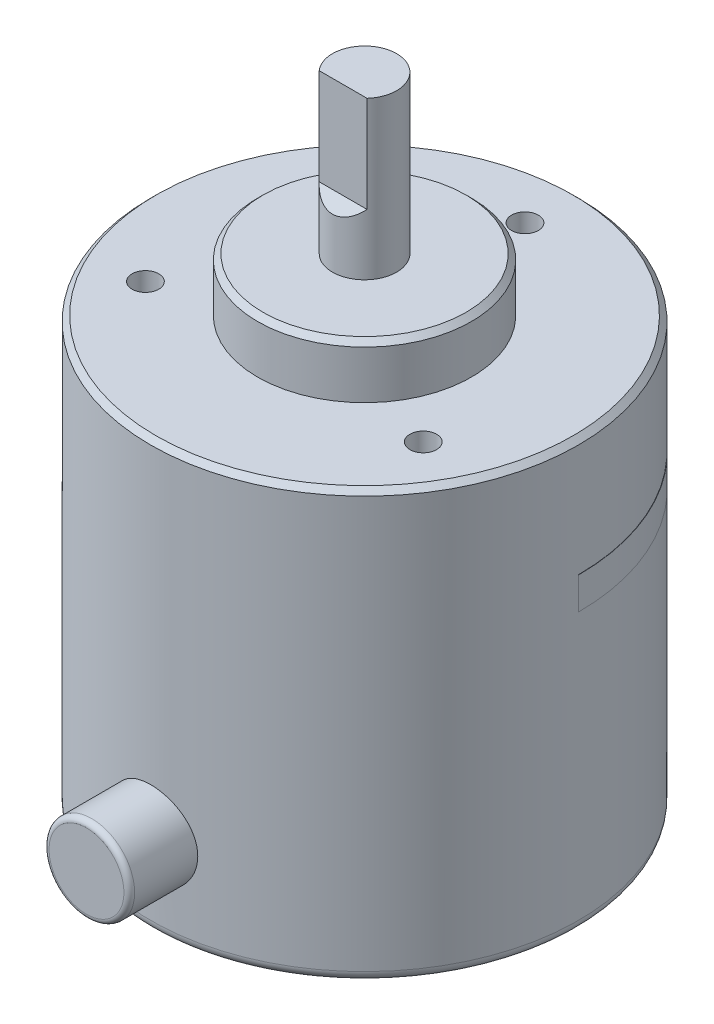
ISO-10303-21;
HEADER;
FILE_DESCRIPTION(('STEP AP214'),'2;1');
FILE_NAME('part.step','',(''),(''),'','','');
FILE_SCHEMA(('AUTOMOTIVE_DESIGN { 1 0 10303 214 1 1 1 1 }'));
ENDSEC;
DATA;
#1=APPLICATION_CONTEXT('core data for automotive mechanical design processes');
#2=APPLICATION_PROTOCOL_DEFINITION('international standard','automotive_design',2000,#1);
#3=PRODUCT_CONTEXT('',#1,'mechanical');
#4=PRODUCT('Part','Part','',(#3));
#5=PRODUCT_RELATED_PRODUCT_CATEGORY('part','',(#4));
#6=PRODUCT_DEFINITION_FORMATION('','',#4);
#7=PRODUCT_DEFINITION_CONTEXT('part definition',#1,'design');
#8=PRODUCT_DEFINITION('design','',#6,#7);
#9=PRODUCT_DEFINITION_SHAPE('','',#8);
#10=(LENGTH_UNIT() NAMED_UNIT(*) SI_UNIT(.MILLI.,.METRE.));
#11=(NAMED_UNIT(*) PLANE_ANGLE_UNIT() SI_UNIT($,.RADIAN.));
#12=(NAMED_UNIT(*) SI_UNIT($,.STERADIAN.) SOLID_ANGLE_UNIT());
#13=UNCERTAINTY_MEASURE_WITH_UNIT(LENGTH_MEASURE(1.E-05),#10,'distance_accuracy_value','');
#14=(GEOMETRIC_REPRESENTATION_CONTEXT(3) GLOBAL_UNCERTAINTY_ASSIGNED_CONTEXT((#13)) GLOBAL_UNIT_ASSIGNED_CONTEXT((#10,
#11,#12)) REPRESENTATION_CONTEXT('',''));
#15=CARTESIAN_POINT('',(0.,0.,0.));
#16=DIRECTION('',(0.,0.,1.));
#17=DIRECTION('',(1.,0.,0.));
#18=AXIS2_PLACEMENT_3D('',#15,#16,#17);
#19=CARTESIAN_POINT('',(0.,0.,0.));
#20=DIRECTION('',(0.,-1.,0.));
#21=DIRECTION('',(0.,0.,-1.));
#22=AXIS2_PLACEMENT_3D('',#19,#20,#21);
#23=CYLINDRICAL_SURFACE('',#22,20.);
#24=CARTESIAN_POINT('',(0.,39.5,0.));
#25=DIRECTION('',(0.,1.,0.));
#26=DIRECTION('',(0.,0.,1.));
#27=AXIS2_PLACEMENT_3D('',#24,#25,#26);
#28=CIRCLE('',#27,20.);
#29=CARTESIAN_POINT('',(0.,39.5,20.));
#30=VERTEX_POINT('',#29);
#31=EDGE_CURVE('E217',#30,#30,#28,.F.);
#32=ORIENTED_EDGE('',*,*,#31,.T.);
#33=EDGE_LOOP('',(#32));
#34=FACE_BOUND('',#33,.T.);
#35=CARTESIAN_POINT('',(0.,1.,0.));
#36=DIRECTION('',(0.,-1.,0.));
#37=DIRECTION('',(0.,0.,-1.));
#38=AXIS2_PLACEMENT_3D('',#35,#36,#37);
#39=CIRCLE('',#38,20.);
#40=CARTESIAN_POINT('',(0.,1.,-20.));
#41=VERTEX_POINT('',#40);
#42=EDGE_CURVE('E221',#41,#41,#39,.F.);
#43=ORIENTED_EDGE('',*,*,#42,.T.);
#44=EDGE_LOOP('',(#43));
#45=FACE_BOUND('',#44,.T.);
#46=CARTESIAN_POINT('',(-4.,8.,19.5959179422654));
#47=CARTESIAN_POINT('',(-3.99999178350109,8.22225750196463,19.5959223610659));
#48=CARTESIAN_POINT('',(-3.98141268687258,8.44461849333336,19.5997403307481));
#49=CARTESIAN_POINT('',(-3.90764913433136,8.88305002057253,19.614577252195));
#50=CARTESIAN_POINT('',(-3.85243538828197,9.09911537854392,19.6256019657915));
#51=CARTESIAN_POINT('',(-3.70718313047898,9.51854921341685,19.6535549488742));
#52=CARTESIAN_POINT('',(-3.61717925661048,9.72193008613036,19.670477344843));
#53=CARTESIAN_POINT('',(-3.40499643068202,10.1106993787878,19.7083119792263));
#54=CARTESIAN_POINT('',(-3.2828192744046,10.2960888021516,19.7292239949384));
#55=CARTESIAN_POINT('',(-3.00791630261375,10.6462440154154,19.7730119877701));
#56=CARTESIAN_POINT('',(-2.85482262365327,10.8107183515359,19.7959095134899));
#57=CARTESIAN_POINT('',(-2.52322715608524,11.1118301343159,19.8408988921039));
#58=CARTESIAN_POINT('',(-2.34472358791194,11.2484656296688,19.8629906884333));
#59=CARTESIAN_POINT('',(-1.96544542369702,11.4911520705138,19.9041118567025));
#60=CARTESIAN_POINT('',(-1.76449027068884,11.5969260552666,19.923112857662));
#61=CARTESIAN_POINT('',(-1.34721660154908,11.7730997481925,19.9556694753453));
#62=CARTESIAN_POINT('',(-1.13089952568221,11.843502767604,19.9692256017648));
#63=CARTESIAN_POINT('',(-0.692067093113977,11.9460287744785,19.9892128275367));
#64=CARTESIAN_POINT('',(-0.469670956859256,11.978643910284,19.9957354515251));
#65=CARTESIAN_POINT('',(-0.0224742737501458,12.0062038073533,20.0012368473441));
#66=CARTESIAN_POINT('',(0.202326039327372,12.0011521985833,20.0002163461104));
#67=CARTESIAN_POINT('',(0.644568002974354,11.9538952791378,19.9908173947406));
#68=CARTESIAN_POINT('',(0.86206885719388,11.9122200913286,19.9825439346335));
#69=CARTESIAN_POINT('',(1.2869265063212,11.7937398701644,19.9596870863764));
#70=CARTESIAN_POINT('',(1.49428289498852,11.7169334312325,19.9451034457617));
#71=CARTESIAN_POINT('',(1.89447785280355,11.5298798394109,19.9110918407982));
#72=CARTESIAN_POINT('',(2.0872166965356,11.4194249955804,19.8916339270086));
#73=CARTESIAN_POINT('',(2.45162018343902,11.1683636910536,19.8500187789518));
#74=CARTESIAN_POINT('',(2.62328239810001,11.0277537609179,19.8278612342103));
#75=CARTESIAN_POINT('',(2.94380572421383,10.7174655115661,19.7828385745769));
#76=CARTESIAN_POINT('',(3.09221726629452,10.5473232530816,19.7599678582952));
#77=CARTESIAN_POINT('',(3.35847397270723,10.184334230197,19.7164628639558));
#78=CARTESIAN_POINT('',(3.47631855891102,9.99148703646719,19.6958286282021));
#79=CARTESIAN_POINT('',(3.6782512592075,9.58791667271281,19.6591218988967));
#80=CARTESIAN_POINT('',(3.76226659111076,9.37715612944145,19.6430592624663));
#81=CARTESIAN_POINT('',(3.89356136651041,8.94411470510394,19.6174590529265));
#82=CARTESIAN_POINT('',(3.94084559782687,8.72183532952331,19.6079206294194));
#83=CARTESIAN_POINT('',(3.99666402414463,8.27614056799842,19.5966191704355));
#84=CARTESIAN_POINT('',(4.00584743559105,8.05280970274832,19.5947258812589));
#85=CARTESIAN_POINT('',(3.98695051324247,7.60780710719395,19.5985794265289));
#86=CARTESIAN_POINT('',(3.95887229249044,7.38613528352515,19.6043258277419));
#87=CARTESIAN_POINT('',(3.86680883229714,6.952925438836,19.6226893000674));
#88=CARTESIAN_POINT('',(3.80317048335733,6.74131062785828,19.6352399606525));
#89=CARTESIAN_POINT('',(3.64216414123393,6.33174688388371,19.665739573994));
#90=CARTESIAN_POINT('',(3.54479336949267,6.13379907825676,19.6836889714312));
#91=CARTESIAN_POINT('',(3.31761656886243,5.75434756019972,19.7232562385014));
#92=CARTESIAN_POINT('',(3.18740431193103,5.57309181479679,19.7449188746014));
#93=CARTESIAN_POINT('',(2.89878228885084,5.23476675199624,19.7893489530601));
#94=CARTESIAN_POINT('',(2.74036962057815,5.07769992700296,19.8121165089513));
#95=CARTESIAN_POINT('',(2.39692909399157,4.78974976325772,19.8566138347701));
#96=CARTESIAN_POINT('',(2.21152999571852,4.65930538140003,19.8783223083477));
#97=CARTESIAN_POINT('',(1.82107158653902,4.43141647400166,19.9178851051444));
#98=CARTESIAN_POINT('',(1.61601310173403,4.33397056262088,19.9357395902083));
#99=CARTESIAN_POINT('',(1.19321072329605,4.17548451301347,19.9654917624428));
#100=CARTESIAN_POINT('',(0.975546693912314,4.11423792709499,19.9774231657041));
#101=CARTESIAN_POINT('',(0.532757818719648,4.02923500934463,19.9941294375064));
#102=CARTESIAN_POINT('',(0.307633874844849,4.00547416209729,19.998905167994));
#103=CARTESIAN_POINT('',(-0.139491575614483,3.99629207614844,20.0007416181646));
#104=CARTESIAN_POINT('',(-0.361479248565975,4.01021087817509,19.9979351419732));
#105=CARTESIAN_POINT('',(-0.799884125262599,4.07453580219131,19.9852017424136));
#106=CARTESIAN_POINT('',(-1.01630139901489,4.12494146539253,19.9752749085772));
#107=CARTESIAN_POINT('',(-1.43701099898026,4.26051596836635,19.9494199345968));
#108=CARTESIAN_POINT('',(-1.64132977296066,4.3456055125239,19.9335054899046));
#109=CARTESIAN_POINT('',(-2.03288488074427,4.54804896532444,19.8973888849472));
#110=CARTESIAN_POINT('',(-2.22011986307138,4.665405423618,19.8771863858795));
#111=CARTESIAN_POINT('',(-2.57545556042366,4.93127754824514,19.8343039662696));
#112=CARTESIAN_POINT('',(-2.74319886445937,5.0802653455351,19.811589336716));
#113=CARTESIAN_POINT('',(-3.05153047103403,5.40420096039508,19.7664489163146));
#114=CARTESIAN_POINT('',(-3.19211233283566,5.5791549179197,19.7440231951488));
#115=CARTESIAN_POINT('',(-3.44356887779993,5.95231726676172,19.7017337093573));
#116=CARTESIAN_POINT('',(-3.55410725847236,6.15075584448501,19.681900142849));
#117=CARTESIAN_POINT('',(-3.7400961970649,6.56373109304041,19.6474094850565));
#118=CARTESIAN_POINT('',(-3.81557858389665,6.77825295474876,19.6327477009994));
#119=CARTESIAN_POINT('',(-3.91467655943062,7.1610498217715,19.6131872455138));
#120=CARTESIAN_POINT('',(-3.94661559409474,7.32714167805583,19.6067513965842));
#121=CARTESIAN_POINT('',(-3.98928007183884,7.66213581820454,19.5981151383634));
#122=CARTESIAN_POINT('',(-4.00000624625057,7.83103800497788,19.5959145830567));
#123=CARTESIAN_POINT('',(-4.,8.,19.5959179422654));
#124=B_SPLINE_CURVE_WITH_KNOTS('',3,(#46,#47,#48,#49,#50,#51,#52,#53,#54,#55,#56,#57,#58,#59,
#60,#61,#62,#63,#64,#65,#66,#67,#68,#69,#70,#71,#72,#73,#74,#75,#76,#77,#78,#79,#80,#81,#82,#83,
#84,#85,#86,#87,#88,#89,#90,#91,#92,#93,#94,#95,#96,#97,#98,#99,#100,#101,#102,#103,#104,#105,
#106,#107,#108,#109,#110,#111,#112,#113,#114,#115,#116,#117,#118,#119,#120,#121,#122,#123),
.UNSPECIFIED.,.T.,.F.,(4,2,2,2,2,2,2,2,2,2,2,2,2,2,2,2,2,2,2,2,2,2,2,2,2,2,2,2,2,2,2,2,2,2,2,2,
2,2,4),(0.,0.666153855477712,1.33284095713719,1.99886599176234,2.66485385943945,
3.33929010193747,4.01377360141688,4.69413601749801,5.37443472986239,6.04576995532322,
6.71704048464993,7.3787515853415,8.04048916295001,8.70639696889213,9.37238143080264,
10.0499738704993,10.7275791249088,11.4066345269111,12.085601400641,12.7529503122011,
13.4202613811714,14.0811736713673,14.7421404142105,15.4117223910154,16.0813733148429,
16.7613040693725,17.4412062652387,18.1171925431805,18.7930973876996,19.457240696622,
20.1213756547048,20.7840006830526,21.4466780854219,22.1200460810584,22.7935735556258,
23.4743559432188,24.1545190036424,24.660952145561,25.1673678274537),.UNSPECIFIED.);
#125=CARTESIAN_POINT('',(-4.,8.,19.5959179422654));
#126=VERTEX_POINT('',#125);
#127=EDGE_CURVE('E146',#126,#126,#124,.T.);
#128=ORIENTED_EDGE('',*,*,#127,.T.);
#129=EDGE_LOOP('',(#128));
#130=FACE_BOUND('',#129,.T.);
#131=DIRECTION('',(0.,-1.,0.));
#132=VECTOR('',#131,1.);
#133=CARTESIAN_POINT('',(-20.,0.,0.));
#134=LINE('',#133,#132);
#135=CARTESIAN_POINT('',(-20.,26.,0.));
#136=VERTEX_POINT('',#135);
#137=CARTESIAN_POINT('',(-20.,29.,0.));
#138=VERTEX_POINT('',#137);
#139=EDGE_CURVE('E47',#136,#138,#134,.F.);
#140=ORIENTED_EDGE('',*,*,#139,.F.);
#141=CARTESIAN_POINT('',(0.,26.,0.));
#142=DIRECTION('',(0.,1.,0.));
#143=DIRECTION('',(0.,0.,1.));
#144=AXIS2_PLACEMENT_3D('',#141,#142,#143);
#145=CIRCLE('',#144,20.);
#146=CARTESIAN_POINT('',(20.,26.,0.));
#147=VERTEX_POINT('',#146);
#148=EDGE_CURVE('E11',#136,#147,#145,.F.);
#149=ORIENTED_EDGE('',*,*,#148,.T.);
#150=DIRECTION('',(0.,-1.,0.));
#151=VECTOR('',#150,1.);
#152=CARTESIAN_POINT('',(20.,0.,0.));
#153=LINE('',#152,#151);
#154=CARTESIAN_POINT('',(20.,29.,0.));
#155=VERTEX_POINT('',#154);
#156=EDGE_CURVE('E246',#155,#147,#153,.T.);
#157=ORIENTED_EDGE('',*,*,#156,.F.);
#158=CARTESIAN_POINT('',(0.,29.,0.));
#159=DIRECTION('',(0.,1.,0.));
#160=DIRECTION('',(0.,0.,1.));
#161=AXIS2_PLACEMENT_3D('',#158,#159,#160);
#162=CIRCLE('',#161,20.);
#163=EDGE_CURVE('E243',#138,#155,#162,.F.);
#164=ORIENTED_EDGE('',*,*,#163,.F.);
#165=EDGE_LOOP('',(#140,#149,#157,#164));
#166=FACE_BOUND('',#165,.T.);
#167=ADVANCED_FACE('F39',(#34,#45,#130,#166),#23,.T.);
#168=CARTESIAN_POINT('',(20.,0.,0.));
#169=DIRECTION('',(0.,-1.,0.));
#170=DIRECTION('',(0.,0.,-1.));
#171=AXIS2_PLACEMENT_3D('',#168,#169,#170);
#172=PLANE('',#171);
#173=CARTESIAN_POINT('',(0.,0.,0.));
#174=DIRECTION('',(0.,-1.,0.));
#175=DIRECTION('',(0.,0.,-1.));
#176=AXIS2_PLACEMENT_3D('',#173,#174,#175);
#177=CIRCLE('',#176,19.);
#178=CARTESIAN_POINT('',(0.,0.,-19.));
#179=VERTEX_POINT('',#178);
#180=EDGE_CURVE('E170',#179,#179,#177,.T.);
#181=ORIENTED_EDGE('',*,*,#180,.T.);
#182=EDGE_LOOP('',(#181));
#183=FACE_BOUND('',#182,.T.);
#184=ADVANCED_FACE('F204',(#183),#172,.T.);
#185=CARTESIAN_POINT('',(0.,59.7,0.));
#186=DIRECTION('',(0.,1.,0.));
#187=DIRECTION('',(0.,0.,1.));
#188=AXIS2_PLACEMENT_3D('',#185,#186,#187);
#189=PLANE('',#188);
#190=DIRECTION('',(-1.,0.,0.));
#191=VECTOR('',#190,1.);
#192=CARTESIAN_POINT('',(6.49951898238044,59.7,2.));
#193=LINE('',#192,#191);
#194=CARTESIAN_POINT('',(2.23606797749979,59.7,2.));
#195=VERTEX_POINT('',#194);
#196=CARTESIAN_POINT('',(-2.23606797749979,59.7,2.));
#197=VERTEX_POINT('',#196);
#198=EDGE_CURVE('E147',#195,#197,#193,.T.);
#199=ORIENTED_EDGE('',*,*,#198,.F.);
#200=CARTESIAN_POINT('',(0.,59.7,0.));
#201=DIRECTION('',(0.,-1.,0.));
#202=DIRECTION('',(0.,0.,-1.));
#203=AXIS2_PLACEMENT_3D('',#200,#201,#202);
#204=CIRCLE('',#203,3.);
#205=EDGE_CURVE('E155',#197,#195,#204,.T.);
#206=ORIENTED_EDGE('',*,*,#205,.F.);
#207=EDGE_LOOP('',(#199,#206));
#208=FACE_BOUND('',#207,.T.);
#209=ADVANCED_FACE('F211',(#208),#189,.T.);
#210=CARTESIAN_POINT('',(0.,0.,0.));
#211=DIRECTION('',(0.,-1.,0.));
#212=DIRECTION('',(0.,0.,-1.));
#213=AXIS2_PLACEMENT_3D('',#210,#211,#212);
#214=CYLINDRICAL_SURFACE('',#213,3.);
#215=DIRECTION('',(0.,-1.,0.));
#216=VECTOR('',#215,1.);
#217=CARTESIAN_POINT('',(2.23606797749979,0.,2.));
#218=LINE('',#217,#216);
#219=CARTESIAN_POINT('',(2.23606797749979,50.7,2.));
#220=VERTEX_POINT('',#219);
#221=EDGE_CURVE('E161',#220,#195,#218,.F.);
#222=ORIENTED_EDGE('',*,*,#221,.F.);
#223=CARTESIAN_POINT('',(0.,52.7,0.));
#224=DIRECTION('',(0.,-0.707106781186552,-0.707106781186543));
#225=DIRECTION('',(0.,-0.707106781186543,0.707106781186552));
#226=AXIS2_PLACEMENT_3D('',#223,#224,#225);
#227=ELLIPSE('',#226,4.24264068711926,3.);
#228=CARTESIAN_POINT('',(0.,49.7,3.00000000000002));
#229=VERTEX_POINT('',#228);
#230=EDGE_CURVE('E168',#220,#229,#227,.T.);
#231=ORIENTED_EDGE('',*,*,#230,.T.);
#232=CARTESIAN_POINT('',(0.,52.7,0.));
#233=DIRECTION('',(0.,-0.707106781186552,-0.707106781186543));
#234=DIRECTION('',(0.,-0.707106781186543,0.707106781186552));
#235=AXIS2_PLACEMENT_3D('',#232,#233,#234);
#236=ELLIPSE('',#235,4.24264068711926,3.);
#237=CARTESIAN_POINT('',(-2.23606797749979,50.7,2.));
#238=VERTEX_POINT('',#237);
#239=EDGE_CURVE('E166',#229,#238,#236,.T.);
#240=ORIENTED_EDGE('',*,*,#239,.T.);
#241=DIRECTION('',(0.,-1.,0.));
#242=VECTOR('',#241,1.);
#243=CARTESIAN_POINT('',(-2.23606797749979,0.,2.));
#244=LINE('',#243,#242);
#245=EDGE_CURVE('E158',#197,#238,#244,.T.);
#246=ORIENTED_EDGE('',*,*,#245,.F.);
#247=ORIENTED_EDGE('',*,*,#205,.T.);
#248=EDGE_LOOP('',(#222,#231,#240,#246,#247));
#249=FACE_BOUND('',#248,.T.);
#250=CARTESIAN_POINT('',(0.,45.,0.));
#251=DIRECTION('',(0.,-1.,0.));
#252=DIRECTION('',(0.,0.,-1.));
#253=AXIS2_PLACEMENT_3D('',#250,#251,#252);
#254=CIRCLE('',#253,3.);
#255=CARTESIAN_POINT('',(0.,45.,-3.));
#256=VERTEX_POINT('',#255);
#257=EDGE_CURVE('E152',#256,#256,#254,.T.);
#258=ORIENTED_EDGE('',*,*,#257,.F.);
#259=EDGE_LOOP('',(#258));
#260=FACE_BOUND('',#259,.T.);
#261=ADVANCED_FACE('F313',(#249,#260),#214,.T.);
#262=CARTESIAN_POINT('',(3.,45.,0.));
#263=DIRECTION('',(0.,1.,0.));
#264=DIRECTION('',(0.,0.,1.));
#265=AXIS2_PLACEMENT_3D('',#262,#263,#264);
#266=PLANE('',#265);
#267=CARTESIAN_POINT('',(0.,45.,0.));
#268=DIRECTION('',(0.,1.,0.));
#269=DIRECTION('',(0.,0.,1.));
#270=AXIS2_PLACEMENT_3D('',#267,#268,#269);
#271=CIRCLE('',#270,9.50000000000001);
#272=CARTESIAN_POINT('',(0.,45.,9.50000000000001));
#273=VERTEX_POINT('',#272);
#274=EDGE_CURVE('E240',#273,#273,#271,.T.);
#275=ORIENTED_EDGE('',*,*,#274,.T.);
#276=EDGE_LOOP('',(#275));
#277=FACE_BOUND('',#276,.T.);
#278=ORIENTED_EDGE('',*,*,#257,.T.);
#279=EDGE_LOOP('',(#278));
#280=FACE_BOUND('',#279,.T.);
#281=ADVANCED_FACE('F307',(#277,#280),#266,.T.);
#282=CARTESIAN_POINT('',(0.,0.,0.));
#283=DIRECTION('',(0.,-1.,0.));
#284=DIRECTION('',(0.,0.,-1.));
#285=AXIS2_PLACEMENT_3D('',#282,#283,#284);
#286=CYLINDRICAL_SURFACE('',#285,10.);
#287=CARTESIAN_POINT('',(0.,44.5,0.));
#288=DIRECTION('',(0.,1.,0.));
#289=DIRECTION('',(0.,0.,1.));
#290=AXIS2_PLACEMENT_3D('',#287,#288,#289);
#291=CIRCLE('',#290,10.);
#292=CARTESIAN_POINT('',(0.,44.5,10.));
#293=VERTEX_POINT('',#292);
#294=EDGE_CURVE('E237',#293,#293,#291,.F.);
#295=ORIENTED_EDGE('',*,*,#294,.T.);
#296=EDGE_LOOP('',(#295));
#297=FACE_BOUND('',#296,.T.);
#298=CARTESIAN_POINT('',(0.,40.,0.));
#299=DIRECTION('',(0.,-1.,0.));
#300=DIRECTION('',(0.,0.,-1.));
#301=AXIS2_PLACEMENT_3D('',#298,#299,#300);
#302=CIRCLE('',#301,10.);
#303=CARTESIAN_POINT('',(0.,40.,-10.));
#304=VERTEX_POINT('',#303);
#305=EDGE_CURVE('E149',#304,#304,#302,.T.);
#306=ORIENTED_EDGE('',*,*,#305,.F.);
#307=EDGE_LOOP('',(#306));
#308=FACE_BOUND('',#307,.T.);
#309=ADVANCED_FACE('F201',(#297,#308),#286,.T.);
#310=CARTESIAN_POINT('',(10.,40.,0.));
#311=DIRECTION('',(0.,1.,0.));
#312=DIRECTION('',(0.,0.,1.));
#313=AXIS2_PLACEMENT_3D('',#310,#311,#312);
#314=PLANE('',#313);
#315=CARTESIAN_POINT('',(-12.9903810567666,40.,7.50000000000001));
#316=DIRECTION('',(0.,1.,0.));
#317=DIRECTION('',(0.,0.,1.));
#318=AXIS2_PLACEMENT_3D('',#315,#316,#317);
#319=CIRCLE('',#318,1.24999999999999);
#320=CARTESIAN_POINT('',(-12.9903810567666,40.,8.75));
#321=VERTEX_POINT('',#320);
#322=EDGE_CURVE('E127',#321,#321,#319,.T.);
#323=ORIENTED_EDGE('',*,*,#322,.F.);
#324=EDGE_LOOP('',(#323));
#325=FACE_BOUND('',#324,.T.);
#326=CARTESIAN_POINT('',(12.9903810567666,40.,7.5));
#327=DIRECTION('',(0.,1.,0.));
#328=DIRECTION('',(0.,0.,1.));
#329=AXIS2_PLACEMENT_3D('',#326,#327,#328);
#330=CIRCLE('',#329,1.24999999999999);
#331=CARTESIAN_POINT('',(12.9903810567666,40.,8.74999999999999));
#332=VERTEX_POINT('',#331);
#333=EDGE_CURVE('E134',#332,#332,#330,.T.);
#334=ORIENTED_EDGE('',*,*,#333,.F.);
#335=EDGE_LOOP('',(#334));
#336=FACE_BOUND('',#335,.T.);
#337=CARTESIAN_POINT('',(0.,40.,-15.));
#338=DIRECTION('',(0.,1.,0.));
#339=DIRECTION('',(0.,0.,1.));
#340=AXIS2_PLACEMENT_3D('',#337,#338,#339);
#341=CIRCLE('',#340,1.24999999999999);
#342=CARTESIAN_POINT('',(0.,40.,-13.75));
#343=VERTEX_POINT('',#342);
#344=EDGE_CURVE('E140',#343,#343,#341,.T.);
#345=ORIENTED_EDGE('',*,*,#344,.F.);
#346=EDGE_LOOP('',(#345));
#347=FACE_BOUND('',#346,.T.);
#348=CARTESIAN_POINT('',(0.,40.,0.));
#349=DIRECTION('',(0.,1.,0.));
#350=DIRECTION('',(0.,0.,1.));
#351=AXIS2_PLACEMENT_3D('',#348,#349,#350);
#352=CIRCLE('',#351,19.5);
#353=CARTESIAN_POINT('',(0.,40.,19.5));
#354=VERTEX_POINT('',#353);
#355=EDGE_CURVE('E234',#354,#354,#352,.T.);
#356=ORIENTED_EDGE('',*,*,#355,.T.);
#357=EDGE_LOOP('',(#356));
#358=FACE_BOUND('',#357,.T.);
#359=ORIENTED_EDGE('',*,*,#305,.T.);
#360=EDGE_LOOP('',(#359));
#361=FACE_BOUND('',#360,.T.);
#362=ADVANCED_FACE('F191',(#325,#336,#347,#358,#361),#314,.T.);
#363=CARTESIAN_POINT('',(6.49951898238044,49.7,2.));
#364=DIRECTION('',(0.,0.,-1.));
#365=DIRECTION('',(-1.,0.,0.));
#366=AXIS2_PLACEMENT_3D('',#363,#364,#365);
#367=PLANE('',#366);
#368=ORIENTED_EDGE('',*,*,#245,.T.);
#369=DIRECTION('',(1.,0.,0.));
#370=VECTOR('',#369,1.);
#371=CARTESIAN_POINT('',(6.49951898238044,50.7,2.));
#372=LINE('',#371,#370);
#373=EDGE_CURVE('E163',#238,#220,#372,.T.);
#374=ORIENTED_EDGE('',*,*,#373,.T.);
#375=ORIENTED_EDGE('',*,*,#221,.T.);
#376=ORIENTED_EDGE('',*,*,#198,.T.);
#377=EDGE_LOOP('',(#368,#374,#375,#376));
#378=FACE_BOUND('',#377,.T.);
#379=ADVANCED_FACE('F189',(#378),#367,.F.);
#380=CARTESIAN_POINT('',(0.,49.7,3.00000000000002));
#381=DIRECTION('',(0.,-0.707106781186552,-0.707106781186543));
#382=DIRECTION('',(-1.,0.,0.));
#383=AXIS2_PLACEMENT_3D('',#380,#381,#382);
#384=PLANE('',#383);
#385=ORIENTED_EDGE('',*,*,#230,.F.);
#386=ORIENTED_EDGE('',*,*,#373,.F.);
#387=ORIENTED_EDGE('',*,*,#239,.F.);
#388=EDGE_LOOP('',(#385,#386,#387));
#389=FACE_BOUND('',#388,.T.);
#390=ADVANCED_FACE('F186',(#389),#384,.F.);
#391=CARTESIAN_POINT('',(0.,8.,26.));
#392=DIRECTION('',(0.,0.,-1.));
#393=DIRECTION('',(-1.,0.,0.));
#394=AXIS2_PLACEMENT_3D('',#391,#392,#393);
#395=CYLINDRICAL_SURFACE('',#394,4.);
#396=CARTESIAN_POINT('',(0.,8.,25.5));
#397=DIRECTION('',(0.,0.,1.));
#398=DIRECTION('',(1.,0.,0.));
#399=AXIS2_PLACEMENT_3D('',#396,#397,#398);
#400=CIRCLE('',#399,4.);
#401=CARTESIAN_POINT('',(4.,8.,25.5));
#402=VERTEX_POINT('',#401);
#403=EDGE_CURVE('E227',#402,#402,#400,.F.);
#404=ORIENTED_EDGE('',*,*,#403,.T.);
#405=EDGE_LOOP('',(#404));
#406=FACE_BOUND('',#405,.T.);
#407=ORIENTED_EDGE('',*,*,#127,.F.);
#408=EDGE_LOOP('',(#407));
#409=FACE_BOUND('',#408,.T.);
#410=ADVANCED_FACE('F181',(#406,#409),#395,.T.);
#411=CARTESIAN_POINT('',(0.,8.,26.));
#412=DIRECTION('',(0.,0.,1.));
#413=DIRECTION('',(1.,0.,0.));
#414=AXIS2_PLACEMENT_3D('',#411,#412,#413);
#415=PLANE('',#414);
#416=CARTESIAN_POINT('',(0.,8.,26.));
#417=DIRECTION('',(0.,0.,1.));
#418=DIRECTION('',(1.,0.,0.));
#419=AXIS2_PLACEMENT_3D('',#416,#417,#418);
#420=CIRCLE('',#419,3.5);
#421=CARTESIAN_POINT('',(3.5,8.,26.));
#422=VERTEX_POINT('',#421);
#423=EDGE_CURVE('E225',#422,#422,#420,.T.);
#424=ORIENTED_EDGE('',*,*,#423,.T.);
#425=EDGE_LOOP('',(#424));
#426=FACE_BOUND('',#425,.T.);
#427=ADVANCED_FACE('F185',(#426),#415,.T.);
#428=CARTESIAN_POINT('',(0.,1.,0.));
#429=DIRECTION('',(0.,-1.,0.));
#430=DIRECTION('',(0.,0.,-1.));
#431=AXIS2_PLACEMENT_3D('',#428,#429,#430);
#432=TOROIDAL_SURFACE('',#431,19.,1.);
#433=ORIENTED_EDGE('',*,*,#42,.F.);
#434=EDGE_LOOP('',(#433));
#435=FACE_BOUND('',#434,.T.);
#436=ORIENTED_EDGE('',*,*,#180,.F.);
#437=EDGE_LOOP('',(#436));
#438=FACE_BOUND('',#437,.T.);
#439=ADVANCED_FACE('F323',(#435,#438),#432,.T.);
#440=CARTESIAN_POINT('',(0.,8.,25.5));
#441=DIRECTION('',(0.,0.,1.));
#442=DIRECTION('',(1.,0.,0.));
#443=AXIS2_PLACEMENT_3D('',#440,#441,#442);
#444=TOROIDAL_SURFACE('',#443,3.5,0.5);
#445=ORIENTED_EDGE('',*,*,#403,.F.);
#446=EDGE_LOOP('',(#445));
#447=FACE_BOUND('',#446,.T.);
#448=ORIENTED_EDGE('',*,*,#423,.F.);
#449=EDGE_LOOP('',(#448));
#450=FACE_BOUND('',#449,.T.);
#451=ADVANCED_FACE('F326',(#447,#450),#444,.T.);
#452=CARTESIAN_POINT('',(0.,39.5,0.));
#453=DIRECTION('',(0.,-1.,0.));
#454=DIRECTION('',(0.,0.,-1.));
#455=AXIS2_PLACEMENT_3D('',#452,#453,#454);
#456=CONICAL_SURFACE('',#455,20.,0.785398163397438);
#457=ORIENTED_EDGE('',*,*,#355,.F.);
#458=EDGE_LOOP('',(#457));
#459=FACE_BOUND('',#458,.T.);
#460=ORIENTED_EDGE('',*,*,#31,.F.);
#461=EDGE_LOOP('',(#460));
#462=FACE_BOUND('',#461,.T.);
#463=ADVANCED_FACE('F294',(#459,#462),#456,.T.);
#464=CARTESIAN_POINT('',(0.,44.5,0.));
#465=DIRECTION('',(0.,-1.,0.));
#466=DIRECTION('',(0.,0.,-1.));
#467=AXIS2_PLACEMENT_3D('',#464,#465,#466);
#468=CONICAL_SURFACE('',#467,10.,0.785398163397447);
#469=ORIENTED_EDGE('',*,*,#274,.F.);
#470=EDGE_LOOP('',(#469));
#471=FACE_BOUND('',#470,.T.);
#472=ORIENTED_EDGE('',*,*,#294,.F.);
#473=EDGE_LOOP('',(#472));
#474=FACE_BOUND('',#473,.T.);
#475=ADVANCED_FACE('F41',(#471,#474),#468,.T.);
#476=CARTESIAN_POINT('',(0.,32.5,-15.));
#477=DIRECTION('',(0.,1.,0.));
#478=DIRECTION('',(0.,0.,1.));
#479=AXIS2_PLACEMENT_3D('',#476,#477,#478);
#480=CONICAL_SURFACE('',#479,1.24999999999999,1.02974425867665);
#481=CARTESIAN_POINT('',(0.,31.7489242262156,-15.));
#482=VERTEX_POINT('',#481);
#483=VERTEX_LOOP('',#482);
#484=FACE_BOUND('',#483,.T.);
#485=CARTESIAN_POINT('',(0.,32.5,-15.));
#486=DIRECTION('',(0.,1.,0.));
#487=DIRECTION('',(0.,0.,1.));
#488=AXIS2_PLACEMENT_3D('',#485,#486,#487);
#489=CIRCLE('',#488,1.24999999999999);
#490=CARTESIAN_POINT('',(0.,32.5,-13.75));
#491=VERTEX_POINT('',#490);
#492=EDGE_CURVE('E143',#491,#491,#489,.T.);
#493=ORIENTED_EDGE('',*,*,#492,.T.);
#494=EDGE_LOOP('',(#493));
#495=FACE_BOUND('',#494,.T.);
#496=ADVANCED_FACE('F287',(#484,#495),#480,.F.);
#497=CARTESIAN_POINT('',(0.,40.,-15.));
#498=DIRECTION('',(0.,1.,0.));
#499=DIRECTION('',(0.,0.,1.));
#500=AXIS2_PLACEMENT_3D('',#497,#498,#499);
#501=CYLINDRICAL_SURFACE('',#500,1.24999999999999);
#502=ORIENTED_EDGE('',*,*,#492,.F.);
#503=EDGE_LOOP('',(#502));
#504=FACE_BOUND('',#503,.T.);
#505=ORIENTED_EDGE('',*,*,#344,.T.);
#506=EDGE_LOOP('',(#505));
#507=FACE_BOUND('',#506,.T.);
#508=ADVANCED_FACE('F284',(#504,#507),#501,.F.);
#509=CARTESIAN_POINT('',(12.9903810567666,32.5,7.5));
#510=DIRECTION('',(0.,1.,0.));
#511=DIRECTION('',(0.,0.,1.));
#512=AXIS2_PLACEMENT_3D('',#509,#510,#511);
#513=CONICAL_SURFACE('',#512,1.24999999999999,1.02974425867665);
#514=CARTESIAN_POINT('',(12.9903810567666,31.7489242262156,7.5));
#515=VERTEX_POINT('',#514);
#516=VERTEX_LOOP('',#515);
#517=FACE_BOUND('',#516,.T.);
#518=CARTESIAN_POINT('',(12.9903810567666,32.5,7.5));
#519=DIRECTION('',(0.,1.,0.));
#520=DIRECTION('',(0.,0.,1.));
#521=AXIS2_PLACEMENT_3D('',#518,#519,#520);
#522=CIRCLE('',#521,1.24999999999999);
#523=CARTESIAN_POINT('',(12.9903810567666,32.5,8.74999999999999));
#524=VERTEX_POINT('',#523);
#525=EDGE_CURVE('E137',#524,#524,#522,.T.);
#526=ORIENTED_EDGE('',*,*,#525,.T.);
#527=EDGE_LOOP('',(#526));
#528=FACE_BOUND('',#527,.T.);
#529=ADVANCED_FACE('F280',(#517,#528),#513,.F.);
#530=CARTESIAN_POINT('',(12.9903810567666,40.,7.5));
#531=DIRECTION('',(0.,1.,0.));
#532=DIRECTION('',(0.,0.,1.));
#533=AXIS2_PLACEMENT_3D('',#530,#531,#532);
#534=CYLINDRICAL_SURFACE('',#533,1.24999999999999);
#535=ORIENTED_EDGE('',*,*,#525,.F.);
#536=EDGE_LOOP('',(#535));
#537=FACE_BOUND('',#536,.T.);
#538=ORIENTED_EDGE('',*,*,#333,.T.);
#539=EDGE_LOOP('',(#538));
#540=FACE_BOUND('',#539,.T.);
#541=ADVANCED_FACE('F272',(#537,#540),#534,.F.);
#542=CARTESIAN_POINT('',(-12.9903810567666,32.5,7.50000000000001));
#543=DIRECTION('',(0.,1.,0.));
#544=DIRECTION('',(0.,0.,1.));
#545=AXIS2_PLACEMENT_3D('',#542,#543,#544);
#546=CONICAL_SURFACE('',#545,1.24999999999999,1.02974425867665);
#547=CARTESIAN_POINT('',(-12.9903810567666,31.7489242262156,7.50000000000001));
#548=VERTEX_POINT('',#547);
#549=VERTEX_LOOP('',#548);
#550=FACE_BOUND('',#549,.T.);
#551=CARTESIAN_POINT('',(-12.9903810567666,32.5,7.50000000000001));
#552=DIRECTION('',(0.,1.,0.));
#553=DIRECTION('',(0.,0.,1.));
#554=AXIS2_PLACEMENT_3D('',#551,#552,#553);
#555=CIRCLE('',#554,1.24999999999999);
#556=CARTESIAN_POINT('',(-12.9903810567666,32.5,8.75));
#557=VERTEX_POINT('',#556);
#558=EDGE_CURVE('E131',#557,#557,#555,.T.);
#559=ORIENTED_EDGE('',*,*,#558,.T.);
#560=EDGE_LOOP('',(#559));
#561=FACE_BOUND('',#560,.T.);
#562=ADVANCED_FACE('F267',(#550,#561),#546,.F.);
#563=CARTESIAN_POINT('',(-12.9903810567666,40.,7.50000000000001));
#564=DIRECTION('',(0.,1.,0.));
#565=DIRECTION('',(0.,0.,1.));
#566=AXIS2_PLACEMENT_3D('',#563,#564,#565);
#567=CYLINDRICAL_SURFACE('',#566,1.24999999999999);
#568=ORIENTED_EDGE('',*,*,#558,.F.);
#569=EDGE_LOOP('',(#568));
#570=FACE_BOUND('',#569,.T.);
#571=ORIENTED_EDGE('',*,*,#322,.T.);
#572=EDGE_LOOP('',(#571));
#573=FACE_BOUND('',#572,.T.);
#574=ADVANCED_FACE('F262',(#570,#573),#567,.F.);
#575=CARTESIAN_POINT('',(20.025,26.,0.));
#576=DIRECTION('',(0.,0.,1.));
#577=DIRECTION('',(1.,0.,0.));
#578=AXIS2_PLACEMENT_3D('',#575,#576,#577);
#579=PLANE('',#578);
#580=DIRECTION('',(1.,0.,0.));
#581=VECTOR('',#580,1.);
#582=CARTESIAN_POINT('',(20.025,26.,0.));
#583=LINE('',#582,#581);
#584=CARTESIAN_POINT('',(-20.025,26.,0.));
#585=VERTEX_POINT('',#584);
#586=EDGE_CURVE('E103',#585,#136,#583,.T.);
#587=ORIENTED_EDGE('',*,*,#586,.T.);
#588=ORIENTED_EDGE('',*,*,#139,.T.);
#589=DIRECTION('',(1.,0.,0.));
#590=VECTOR('',#589,1.);
#591=CARTESIAN_POINT('',(20.025,29.,0.));
#592=LINE('',#591,#590);
#593=CARTESIAN_POINT('',(-20.025,29.,0.));
#594=VERTEX_POINT('',#593);
#595=EDGE_CURVE('E105',#594,#138,#592,.T.);
#596=ORIENTED_EDGE('',*,*,#595,.F.);
#597=DIRECTION('',(0.,1.,0.));
#598=VECTOR('',#597,1.);
#599=CARTESIAN_POINT('',(-20.025,26.,0.));
#600=LINE('',#599,#598);
#601=EDGE_CURVE('E99',#585,#594,#600,.T.);
#602=ORIENTED_EDGE('',*,*,#601,.F.);
#603=EDGE_LOOP('',(#587,#588,#596,#602));
#604=FACE_BOUND('',#603,.T.);
#605=ADVANCED_FACE('F101',(#604),#579,.T.);
#606=CARTESIAN_POINT('',(0.,26.,0.));
#607=DIRECTION('',(0.,1.,0.));
#608=DIRECTION('',(0.,0.,1.));
#609=AXIS2_PLACEMENT_3D('',#606,#607,#608);
#610=CYLINDRICAL_SURFACE('',#609,20.025);
#611=CARTESIAN_POINT('',(0.,29.,0.));
#612=DIRECTION('',(0.,1.,0.));
#613=DIRECTION('',(0.,0.,1.));
#614=AXIS2_PLACEMENT_3D('',#611,#612,#613);
#615=CIRCLE('',#614,20.025);
#616=CARTESIAN_POINT('',(20.025,29.,0.));
#617=VERTEX_POINT('',#616);
#618=EDGE_CURVE('E123',#617,#594,#615,.T.);
#619=ORIENTED_EDGE('',*,*,#618,.F.);
#620=DIRECTION('',(0.,1.,0.));
#621=VECTOR('',#620,1.);
#622=CARTESIAN_POINT('',(20.025,26.,0.));
#623=LINE('',#622,#621);
#624=CARTESIAN_POINT('',(20.025,26.,0.));
#625=VERTEX_POINT('',#624);
#626=EDGE_CURVE('E109',#625,#617,#623,.T.);
#627=ORIENTED_EDGE('',*,*,#626,.F.);
#628=CARTESIAN_POINT('',(0.,26.,0.));
#629=DIRECTION('',(0.,1.,0.));
#630=DIRECTION('',(0.,0.,1.));
#631=AXIS2_PLACEMENT_3D('',#628,#629,#630);
#632=CIRCLE('',#631,20.025);
#633=EDGE_CURVE('E113',#625,#585,#632,.T.);
#634=ORIENTED_EDGE('',*,*,#633,.T.);
#635=ORIENTED_EDGE('',*,*,#601,.T.);
#636=EDGE_LOOP('',(#619,#627,#634,#635));
#637=FACE_BOUND('',#636,.T.);
#638=ADVANCED_FACE('F114',(#637),#610,.T.);
#639=EDGE_CURVE('E125',#155,#617,#592,.T.);
#640=ORIENTED_EDGE('',*,*,#639,.F.);
#641=ORIENTED_EDGE('',*,*,#156,.T.);
#642=EDGE_CURVE('E118',#147,#625,#583,.T.);
#643=ORIENTED_EDGE('',*,*,#642,.T.);
#644=ORIENTED_EDGE('',*,*,#626,.T.);
#645=EDGE_LOOP('',(#640,#641,#643,#644));
#646=FACE_BOUND('',#645,.T.);
#647=ADVANCED_FACE('F251',(#646),#579,.T.);
#648=CARTESIAN_POINT('',(0.,26.,0.));
#649=DIRECTION('',(0.,1.,0.));
#650=DIRECTION('',(0.,0.,1.));
#651=AXIS2_PLACEMENT_3D('',#648,#649,#650);
#652=PLANE('',#651);
#653=ORIENTED_EDGE('',*,*,#148,.F.);
#654=ORIENTED_EDGE('',*,*,#586,.F.);
#655=ORIENTED_EDGE('',*,*,#633,.F.);
#656=ORIENTED_EDGE('',*,*,#642,.F.);
#657=EDGE_LOOP('',(#653,#654,#655,#656));
#658=FACE_BOUND('',#657,.T.);
#659=ADVANCED_FACE('F120',(#658),#652,.F.);
#660=CARTESIAN_POINT('',(0.,29.,0.));
#661=DIRECTION('',(0.,1.,0.));
#662=DIRECTION('',(0.,0.,1.));
#663=AXIS2_PLACEMENT_3D('',#660,#661,#662);
#664=PLANE('',#663);
#665=ORIENTED_EDGE('',*,*,#595,.T.);
#666=ORIENTED_EDGE('',*,*,#163,.T.);
#667=ORIENTED_EDGE('',*,*,#639,.T.);
#668=ORIENTED_EDGE('',*,*,#618,.T.);
#669=EDGE_LOOP('',(#665,#666,#667,#668));
#670=FACE_BOUND('',#669,.T.);
#671=ADVANCED_FACE('F248',(#670),#664,.T.);
#672=CLOSED_SHELL('',(#167,#184,#209,#261,#281,#309,#362,#379,#390,#410,#427,#439,#451,#463,
#475,#496,#508,#529,#541,#562,#574,#605,#638,#647,#659,#671));
#673=MANIFOLD_SOLID_BREP('B2',#672);
#674=ADVANCED_BREP_SHAPE_REPRESENTATION('',(#18,#673),#14);
#675=SHAPE_DEFINITION_REPRESENTATION(#9,#674);
ENDSEC;
END-ISO-10303-21;
